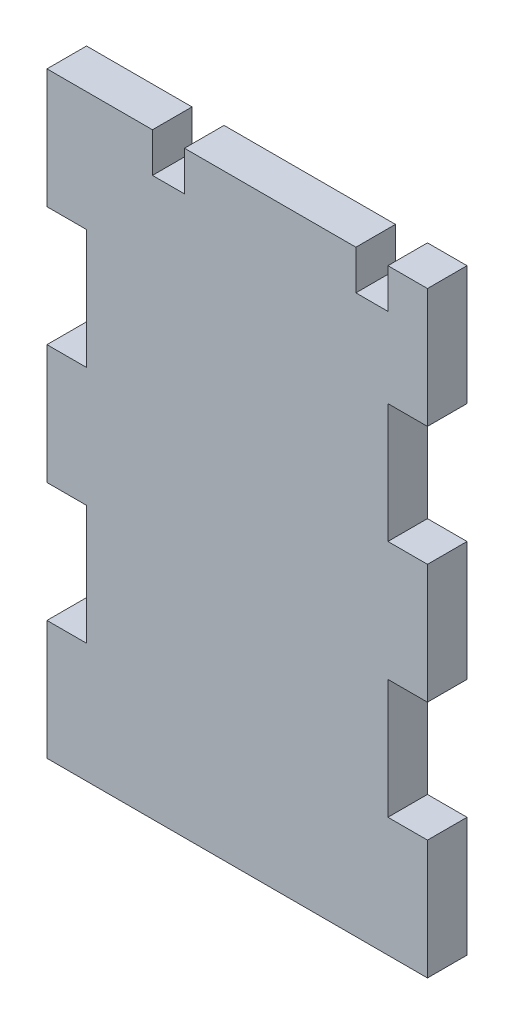
ISO-10303-21;
HEADER;
FILE_DESCRIPTION(('STEP AP214'),'2;1');
FILE_NAME('part.step','',(''),(''),'','','');
FILE_SCHEMA(('AUTOMOTIVE_DESIGN { 1 0 10303 214 1 1 1 1 }'));
ENDSEC;
DATA;
#1=APPLICATION_CONTEXT('core data for automotive mechanical design processes');
#2=APPLICATION_PROTOCOL_DEFINITION('international standard','automotive_design',2000,#1);
#3=PRODUCT_CONTEXT('',#1,'mechanical');
#4=PRODUCT('Part','Part','',(#3));
#5=PRODUCT_RELATED_PRODUCT_CATEGORY('part','',(#4));
#6=PRODUCT_DEFINITION_FORMATION('','',#4);
#7=PRODUCT_DEFINITION_CONTEXT('part definition',#1,'design');
#8=PRODUCT_DEFINITION('design','',#6,#7);
#9=PRODUCT_DEFINITION_SHAPE('','',#8);
#10=(LENGTH_UNIT() NAMED_UNIT(*) SI_UNIT(.MILLI.,.METRE.));
#11=(NAMED_UNIT(*) PLANE_ANGLE_UNIT() SI_UNIT($,.RADIAN.));
#12=(NAMED_UNIT(*) SI_UNIT($,.STERADIAN.) SOLID_ANGLE_UNIT());
#13=UNCERTAINTY_MEASURE_WITH_UNIT(LENGTH_MEASURE(1.E-05),#10,'distance_accuracy_value','');
#14=(GEOMETRIC_REPRESENTATION_CONTEXT(3) GLOBAL_UNCERTAINTY_ASSIGNED_CONTEXT((#13)) GLOBAL_UNIT_ASSIGNED_CONTEXT((#10,
#11,#12)) REPRESENTATION_CONTEXT('',''));
#15=CARTESIAN_POINT('',(0.,0.,0.));
#16=DIRECTION('',(0.,0.,1.));
#17=DIRECTION('',(1.,0.,0.));
#18=AXIS2_PLACEMENT_3D('',#15,#16,#17);
#19=CARTESIAN_POINT('',(-38.9472787322979,40.8312132811787,5.334));
#20=DIRECTION('',(0.,-1.,0.));
#21=DIRECTION('',(0.,0.,-1.));
#22=AXIS2_PLACEMENT_3D('',#19,#20,#21);
#23=PLANE('',#22);
#24=DIRECTION('',(-1.,0.,0.));
#25=VECTOR('',#24,1.);
#26=CARTESIAN_POINT('',(-38.9472787322979,40.8312132811787,0.));
#27=LINE('',#26,#25);
#28=CARTESIAN_POINT('',(2.70872126770206,40.8312132811787,0.));
#29=VERTEX_POINT('',#28);
#30=CARTESIAN_POINT('',(-20.4052787322979,40.8312132811785,0.));
#31=VERTEX_POINT('',#30);
#32=EDGE_CURVE('E236',#29,#31,#27,.T.);
#33=ORIENTED_EDGE('',*,*,#32,.T.);
#34=DIRECTION('',(0.,0.,1.));
#35=VECTOR('',#34,1.);
#36=CARTESIAN_POINT('',(-20.4052787322979,40.8312132811785,0.));
#37=LINE('',#36,#35);
#38=CARTESIAN_POINT('',(-20.4052787322979,40.8312132811785,5.334));
#39=VERTEX_POINT('',#38);
#40=EDGE_CURVE('E220',#31,#39,#37,.T.);
#41=ORIENTED_EDGE('',*,*,#40,.T.);
#42=DIRECTION('',(-1.,0.,0.));
#43=VECTOR('',#42,1.);
#44=CARTESIAN_POINT('',(-38.9472787322979,40.8312132811787,5.334));
#45=LINE('',#44,#43);
#46=CARTESIAN_POINT('',(2.70872126770206,40.8312132811787,5.334));
#47=VERTEX_POINT('',#46);
#48=EDGE_CURVE('E292',#47,#39,#45,.T.);
#49=ORIENTED_EDGE('',*,*,#48,.F.);
#50=DIRECTION('',(0.,0.,1.));
#51=VECTOR('',#50,1.);
#52=CARTESIAN_POINT('',(2.70872126770206,40.8312132811787,0.));
#53=LINE('',#52,#51);
#54=EDGE_CURVE('E242',#29,#47,#53,.T.);
#55=ORIENTED_EDGE('',*,*,#54,.F.);
#56=EDGE_LOOP('',(#33,#41,#49,#55));
#57=FACE_BOUND('',#56,.T.);
#58=ADVANCED_FACE('F35',(#57),#23,.F.);
#59=CARTESIAN_POINT('',(12.3607212677021,40.8312132811787,0.));
#60=VERTEX_POINT('',#59);
#61=CARTESIAN_POINT('',(7.02672126770205,40.8312132811787,0.));
#62=VERTEX_POINT('',#61);
#63=EDGE_CURVE('E243',#60,#62,#27,.T.);
#64=ORIENTED_EDGE('',*,*,#63,.T.);
#65=DIRECTION('',(0.,0.,1.));
#66=VECTOR('',#65,1.);
#67=CARTESIAN_POINT('',(7.02672126770205,40.8312132811787,0.));
#68=LINE('',#67,#66);
#69=CARTESIAN_POINT('',(7.02672126770205,40.8312132811787,5.334));
#70=VERTEX_POINT('',#69);
#71=EDGE_CURVE('E396',#62,#70,#68,.T.);
#72=ORIENTED_EDGE('',*,*,#71,.T.);
#73=CARTESIAN_POINT('',(12.3607212677021,40.8312132811787,5.334));
#74=VERTEX_POINT('',#73);
#75=EDGE_CURVE('E256',#74,#70,#45,.T.);
#76=ORIENTED_EDGE('',*,*,#75,.F.);
#77=DIRECTION('',(0.,0.,-1.));
#78=VECTOR('',#77,1.);
#79=CARTESIAN_POINT('',(12.3607212677021,40.8312132811787,5.334));
#80=LINE('',#79,#78);
#81=EDGE_CURVE('E255',#74,#60,#80,.T.);
#82=ORIENTED_EDGE('',*,*,#81,.T.);
#83=EDGE_LOOP('',(#64,#72,#76,#82));
#84=FACE_BOUND('',#83,.T.);
#85=ADVANCED_FACE('F460',(#84),#23,.F.);
#86=CARTESIAN_POINT('',(12.3607212677021,40.8312132811787,5.334));
#87=DIRECTION('',(-1.,0.,0.));
#88=DIRECTION('',(0.,-1.,0.));
#89=AXIS2_PLACEMENT_3D('',#86,#87,#88);
#90=PLANE('',#89);
#91=DIRECTION('',(0.,1.,0.));
#92=VECTOR('',#91,1.);
#93=CARTESIAN_POINT('',(12.3607212677021,40.8312132811787,0.));
#94=LINE('',#93,#92);
#95=CARTESIAN_POINT('',(12.3607212677021,-7.47958671882125,0.));
#96=VERTEX_POINT('',#95);
#97=CARTESIAN_POINT('',(12.360721267702,8.62401328117875,0.));
#98=VERTEX_POINT('',#97);
#99=EDGE_CURVE('E277',#96,#98,#94,.T.);
#100=ORIENTED_EDGE('',*,*,#99,.T.);
#101=DIRECTION('',(0.,0.,1.));
#102=VECTOR('',#101,1.);
#103=CARTESIAN_POINT('',(12.360721267702,8.62401328117875,0.));
#104=LINE('',#103,#102);
#105=CARTESIAN_POINT('',(12.360721267702,8.62401328117875,5.334));
#106=VERTEX_POINT('',#105);
#107=EDGE_CURVE('E378',#98,#106,#104,.T.);
#108=ORIENTED_EDGE('',*,*,#107,.T.);
#109=DIRECTION('',(0.,1.,0.));
#110=VECTOR('',#109,1.);
#111=CARTESIAN_POINT('',(12.3607212677021,40.8312132811787,5.334));
#112=LINE('',#111,#110);
#113=CARTESIAN_POINT('',(12.3607212677021,-7.47958671882125,5.334));
#114=VERTEX_POINT('',#113);
#115=EDGE_CURVE('E295',#114,#106,#112,.T.);
#116=ORIENTED_EDGE('',*,*,#115,.F.);
#117=DIRECTION('',(0.,0.,1.));
#118=VECTOR('',#117,1.);
#119=CARTESIAN_POINT('',(12.3607212677021,-7.47958671882125,0.));
#120=LINE('',#119,#118);
#121=EDGE_CURVE('E358',#96,#114,#120,.T.);
#122=ORIENTED_EDGE('',*,*,#121,.F.);
#123=EDGE_LOOP('',(#100,#108,#116,#122));
#124=FACE_BOUND('',#123,.T.);
#125=ADVANCED_FACE('F473',(#124),#90,.F.);
#126=CARTESIAN_POINT('',(12.3607212677021,-39.6867867188213,0.));
#127=VERTEX_POINT('',#126);
#128=CARTESIAN_POINT('',(12.3607212677021,-23.5831867188212,0.));
#129=VERTEX_POINT('',#128);
#130=EDGE_CURVE('E248',#127,#129,#94,.T.);
#131=ORIENTED_EDGE('',*,*,#130,.T.);
#132=DIRECTION('',(0.,0.,1.));
#133=VECTOR('',#132,1.);
#134=CARTESIAN_POINT('',(12.3607212677021,-23.5831867188212,0.));
#135=LINE('',#134,#133);
#136=CARTESIAN_POINT('',(12.3607212677021,-23.5831867188212,5.334));
#137=VERTEX_POINT('',#136);
#138=EDGE_CURVE('E356',#129,#137,#135,.T.);
#139=ORIENTED_EDGE('',*,*,#138,.T.);
#140=CARTESIAN_POINT('',(12.3607212677021,-39.6867867188213,5.334));
#141=VERTEX_POINT('',#140);
#142=EDGE_CURVE('E267',#141,#137,#112,.T.);
#143=ORIENTED_EDGE('',*,*,#142,.F.);
#144=DIRECTION('',(0.,0.,-1.));
#145=VECTOR('',#144,1.);
#146=CARTESIAN_POINT('',(12.3607212677021,-39.6867867188213,5.334));
#147=LINE('',#146,#145);
#148=EDGE_CURVE('E43',#141,#127,#147,.T.);
#149=ORIENTED_EDGE('',*,*,#148,.T.);
#150=EDGE_LOOP('',(#131,#139,#143,#149));
#151=FACE_BOUND('',#150,.T.);
#152=ADVANCED_FACE('F264',(#151),#90,.F.);
#153=CARTESIAN_POINT('',(-38.9472787322979,40.8312132811787,5.334));
#154=DIRECTION('',(1.,0.,0.));
#155=DIRECTION('',(0.,0.,-1.));
#156=AXIS2_PLACEMENT_3D('',#153,#154,#155);
#157=PLANE('',#156);
#158=DIRECTION('',(0.,-1.,0.));
#159=VECTOR('',#158,1.);
#160=CARTESIAN_POINT('',(-38.9472787322979,40.8312132811787,0.));
#161=LINE('',#160,#159);
#162=CARTESIAN_POINT('',(-38.9472787322979,8.62401328117875,0.));
#163=VERTEX_POINT('',#162);
#164=CARTESIAN_POINT('',(-38.9472787322979,-7.47958671882126,0.));
#165=VERTEX_POINT('',#164);
#166=EDGE_CURVE('E286',#163,#165,#161,.T.);
#167=ORIENTED_EDGE('',*,*,#166,.T.);
#168=DIRECTION('',(0.,0.,1.));
#169=VECTOR('',#168,1.);
#170=CARTESIAN_POINT('',(-38.9472787322979,-7.47958671882126,0.));
#171=LINE('',#170,#169);
#172=CARTESIAN_POINT('',(-38.9472787322979,-7.47958671882126,5.334));
#173=VERTEX_POINT('',#172);
#174=EDGE_CURVE('E322',#165,#173,#171,.T.);
#175=ORIENTED_EDGE('',*,*,#174,.T.);
#176=DIRECTION('',(0.,-1.,0.));
#177=VECTOR('',#176,1.);
#178=CARTESIAN_POINT('',(-38.9472787322979,40.8312132811787,5.334));
#179=LINE('',#178,#177);
#180=CARTESIAN_POINT('',(-38.9472787322979,8.62401328117875,5.334));
#181=VERTEX_POINT('',#180);
#182=EDGE_CURVE('E302',#181,#173,#179,.T.);
#183=ORIENTED_EDGE('',*,*,#182,.F.);
#184=DIRECTION('',(0.,0.,1.));
#185=VECTOR('',#184,1.);
#186=CARTESIAN_POINT('',(-38.9472787322979,8.62401328117875,0.));
#187=LINE('',#186,#185);
#188=EDGE_CURVE('E303',#163,#181,#187,.T.);
#189=ORIENTED_EDGE('',*,*,#188,.F.);
#190=EDGE_LOOP('',(#167,#175,#183,#189));
#191=FACE_BOUND('',#190,.T.);
#192=ADVANCED_FACE('F513',(#191),#157,.F.);
#193=CARTESIAN_POINT('',(-38.9472787322979,40.8312132811787,0.));
#194=VERTEX_POINT('',#193);
#195=CARTESIAN_POINT('',(-38.9472787322979,24.7276132811787,0.));
#196=VERTEX_POINT('',#195);
#197=EDGE_CURVE('E284',#194,#196,#161,.T.);
#198=ORIENTED_EDGE('',*,*,#197,.T.);
#199=DIRECTION('',(0.,0.,1.));
#200=VECTOR('',#199,1.);
#201=CARTESIAN_POINT('',(-38.9472787322979,24.7276132811787,0.));
#202=LINE('',#201,#200);
#203=CARTESIAN_POINT('',(-38.9472787322979,24.7276132811787,5.334));
#204=VERTEX_POINT('',#203);
#205=EDGE_CURVE('E310',#196,#204,#202,.T.);
#206=ORIENTED_EDGE('',*,*,#205,.T.);
#207=CARTESIAN_POINT('',(-38.9472787322979,40.8312132811787,5.334));
#208=VERTEX_POINT('',#207);
#209=EDGE_CURVE('E299',#208,#204,#179,.T.);
#210=ORIENTED_EDGE('',*,*,#209,.F.);
#211=DIRECTION('',(0.,0.,-1.));
#212=VECTOR('',#211,1.);
#213=CARTESIAN_POINT('',(-38.9472787322979,40.8312132811787,5.334));
#214=LINE('',#213,#212);
#215=EDGE_CURVE('E252',#208,#194,#214,.T.);
#216=ORIENTED_EDGE('',*,*,#215,.T.);
#217=EDGE_LOOP('',(#198,#206,#210,#216));
#218=FACE_BOUND('',#217,.T.);
#219=ADVANCED_FACE('F517',(#218),#157,.F.);
#220=CARTESIAN_POINT('',(-38.9472787322979,-23.5831867188213,5.334));
#221=VERTEX_POINT('',#220);
#222=CARTESIAN_POINT('',(-38.9472787322979,-39.6867867188213,5.334));
#223=VERTEX_POINT('',#222);
#224=EDGE_CURVE('E247',#221,#223,#179,.T.);
#225=ORIENTED_EDGE('',*,*,#224,.F.);
#226=DIRECTION('',(0.,0.,1.));
#227=VECTOR('',#226,1.);
#228=CARTESIAN_POINT('',(-38.9472787322979,-23.5831867188213,0.));
#229=LINE('',#228,#227);
#230=CARTESIAN_POINT('',(-38.9472787322979,-23.5831867188213,0.));
#231=VERTEX_POINT('',#230);
#232=EDGE_CURVE('E330',#231,#221,#229,.T.);
#233=ORIENTED_EDGE('',*,*,#232,.F.);
#234=CARTESIAN_POINT('',(-38.9472787322979,-39.6867867188213,0.));
#235=VERTEX_POINT('',#234);
#236=EDGE_CURVE('E288',#231,#235,#161,.T.);
#237=ORIENTED_EDGE('',*,*,#236,.T.);
#238=DIRECTION('',(0.,0.,-1.));
#239=VECTOR('',#238,1.);
#240=CARTESIAN_POINT('',(-38.9472787322979,-39.6867867188213,5.334));
#241=LINE('',#240,#239);
#242=EDGE_CURVE('E11',#223,#235,#241,.T.);
#243=ORIENTED_EDGE('',*,*,#242,.F.);
#244=EDGE_LOOP('',(#225,#233,#237,#243));
#245=FACE_BOUND('',#244,.T.);
#246=ADVANCED_FACE('F37',(#245),#157,.F.);
#247=CARTESIAN_POINT('',(-38.9472787322979,-39.6867867188213,5.334));
#248=DIRECTION('',(0.,1.,0.));
#249=DIRECTION('',(0.,0.,1.));
#250=AXIS2_PLACEMENT_3D('',#247,#248,#249);
#251=PLANE('',#250);
#252=DIRECTION('',(1.,0.,0.));
#253=VECTOR('',#252,1.);
#254=CARTESIAN_POINT('',(-38.9472787322979,-39.6867867188213,0.));
#255=LINE('',#254,#253);
#256=EDGE_CURVE('E273',#235,#127,#255,.T.);
#257=ORIENTED_EDGE('',*,*,#256,.T.);
#258=ORIENTED_EDGE('',*,*,#148,.F.);
#259=DIRECTION('',(1.,0.,0.));
#260=VECTOR('',#259,1.);
#261=CARTESIAN_POINT('',(-38.9472787322979,-39.6867867188213,5.334));
#262=LINE('',#261,#260);
#263=EDGE_CURVE('E297',#223,#141,#262,.T.);
#264=ORIENTED_EDGE('',*,*,#263,.F.);
#265=ORIENTED_EDGE('',*,*,#242,.T.);
#266=EDGE_LOOP('',(#257,#258,#264,#265));
#267=FACE_BOUND('',#266,.T.);
#268=ADVANCED_FACE('F507',(#267),#251,.F.);
#269=CARTESIAN_POINT('',(12.3607212677021,24.7276132811787,5.334));
#270=VERTEX_POINT('',#269);
#271=EDGE_CURVE('E296',#270,#74,#112,.T.);
#272=ORIENTED_EDGE('',*,*,#271,.F.);
#273=DIRECTION('',(0.,0.,1.));
#274=VECTOR('',#273,1.);
#275=CARTESIAN_POINT('',(12.3607212677021,24.7276132811787,0.));
#276=LINE('',#275,#274);
#277=CARTESIAN_POINT('',(12.3607212677021,24.7276132811787,0.));
#278=VERTEX_POINT('',#277);
#279=EDGE_CURVE('E381',#278,#270,#276,.T.);
#280=ORIENTED_EDGE('',*,*,#279,.F.);
#281=EDGE_CURVE('E278',#278,#60,#94,.T.);
#282=ORIENTED_EDGE('',*,*,#281,.T.);
#283=ORIENTED_EDGE('',*,*,#81,.F.);
#284=EDGE_LOOP('',(#272,#280,#282,#283));
#285=FACE_BOUND('',#284,.T.);
#286=ADVANCED_FACE('F463',(#285),#90,.F.);
#287=CARTESIAN_POINT('',(-24.7232787322979,40.8312132811785,5.334));
#288=VERTEX_POINT('',#287);
#289=EDGE_CURVE('E293',#288,#208,#45,.T.);
#290=ORIENTED_EDGE('',*,*,#289,.F.);
#291=DIRECTION('',(0.,0.,1.));
#292=VECTOR('',#291,1.);
#293=CARTESIAN_POINT('',(-24.7232787322979,40.8312132811785,0.));
#294=LINE('',#293,#292);
#295=CARTESIAN_POINT('',(-24.7232787322979,40.8312132811785,0.));
#296=VERTEX_POINT('',#295);
#297=EDGE_CURVE('E230',#296,#288,#294,.T.);
#298=ORIENTED_EDGE('',*,*,#297,.F.);
#299=EDGE_CURVE('E244',#296,#194,#27,.T.);
#300=ORIENTED_EDGE('',*,*,#299,.T.);
#301=ORIENTED_EDGE('',*,*,#215,.F.);
#302=EDGE_LOOP('',(#290,#298,#300,#301));
#303=FACE_BOUND('',#302,.T.);
#304=ADVANCED_FACE('F445',(#303),#23,.F.);
#305=CARTESIAN_POINT('',(0.,0.,5.334));
#306=DIRECTION('',(0.,0.,1.));
#307=DIRECTION('',(1.,0.,0.));
#308=AXIS2_PLACEMENT_3D('',#305,#306,#307);
#309=PLANE('',#308);
#310=DIRECTION('',(0.,1.,0.));
#311=VECTOR('',#310,1.);
#312=CARTESIAN_POINT('',(-20.4052787322979,35.4972132811785,5.334));
#313=LINE('',#312,#311);
#314=CARTESIAN_POINT('',(-20.4052787322979,35.4972132811785,5.334));
#315=VERTEX_POINT('',#314);
#316=EDGE_CURVE('E225',#315,#39,#313,.T.);
#317=ORIENTED_EDGE('',*,*,#316,.F.);
#318=DIRECTION('',(1.,0.,0.));
#319=VECTOR('',#318,1.);
#320=CARTESIAN_POINT('',(-20.4052787322979,35.4972132811785,5.334));
#321=LINE('',#320,#319);
#322=CARTESIAN_POINT('',(-24.7232787322979,35.4972132811785,5.334));
#323=VERTEX_POINT('',#322);
#324=EDGE_CURVE('E239',#323,#315,#321,.T.);
#325=ORIENTED_EDGE('',*,*,#324,.F.);
#326=DIRECTION('',(0.,-1.,0.));
#327=VECTOR('',#326,1.);
#328=CARTESIAN_POINT('',(-24.7232787322979,35.4972132811785,5.334));
#329=LINE('',#328,#327);
#330=EDGE_CURVE('E432',#288,#323,#329,.T.);
#331=ORIENTED_EDGE('',*,*,#330,.F.);
#332=ORIENTED_EDGE('',*,*,#289,.T.);
#333=ORIENTED_EDGE('',*,*,#209,.T.);
#334=DIRECTION('',(-1.,0.,0.));
#335=VECTOR('',#334,1.);
#336=CARTESIAN_POINT('',(-38.9472787322979,24.7276132811787,5.334));
#337=LINE('',#336,#335);
#338=CARTESIAN_POINT('',(-33.6132787322979,24.7276132811787,5.334));
#339=VERTEX_POINT('',#338);
#340=EDGE_CURVE('E313',#339,#204,#337,.T.);
#341=ORIENTED_EDGE('',*,*,#340,.F.);
#342=DIRECTION('',(0.,1.,0.));
#343=VECTOR('',#342,1.);
#344=CARTESIAN_POINT('',(-33.6132787322979,24.7276132811787,5.334));
#345=LINE('',#344,#343);
#346=CARTESIAN_POINT('',(-33.6132787322979,8.62401328117875,5.334));
#347=VERTEX_POINT('',#346);
#348=EDGE_CURVE('E316',#347,#339,#345,.T.);
#349=ORIENTED_EDGE('',*,*,#348,.F.);
#350=DIRECTION('',(1.,0.,0.));
#351=VECTOR('',#350,1.);
#352=CARTESIAN_POINT('',(-38.9472787322979,8.62401328117875,5.334));
#353=LINE('',#352,#351);
#354=EDGE_CURVE('E319',#181,#347,#353,.T.);
#355=ORIENTED_EDGE('',*,*,#354,.F.);
#356=ORIENTED_EDGE('',*,*,#182,.T.);
#357=DIRECTION('',(-1.,0.,0.));
#358=VECTOR('',#357,1.);
#359=CARTESIAN_POINT('',(-38.9472787322979,-7.47958671882126,5.334));
#360=LINE('',#359,#358);
#361=CARTESIAN_POINT('',(-33.6132787322979,-7.47958671882126,5.334));
#362=VERTEX_POINT('',#361);
#363=EDGE_CURVE('E339',#362,#173,#360,.T.);
#364=ORIENTED_EDGE('',*,*,#363,.F.);
#365=DIRECTION('',(0.,1.,0.));
#366=VECTOR('',#365,1.);
#367=CARTESIAN_POINT('',(-33.6132787322979,-7.47958671882126,5.334));
#368=LINE('',#367,#366);
#369=CARTESIAN_POINT('',(-33.6132787322979,-23.5831867188213,5.334));
#370=VERTEX_POINT('',#369);
#371=EDGE_CURVE('E342',#370,#362,#368,.T.);
#372=ORIENTED_EDGE('',*,*,#371,.F.);
#373=DIRECTION('',(1.,0.,0.));
#374=VECTOR('',#373,1.);
#375=CARTESIAN_POINT('',(-38.9472787322979,-23.5831867188213,5.334));
#376=LINE('',#375,#374);
#377=EDGE_CURVE('E345',#221,#370,#376,.T.);
#378=ORIENTED_EDGE('',*,*,#377,.F.);
#379=ORIENTED_EDGE('',*,*,#224,.T.);
#380=ORIENTED_EDGE('',*,*,#263,.T.);
#381=ORIENTED_EDGE('',*,*,#142,.T.);
#382=DIRECTION('',(1.,0.,0.));
#383=VECTOR('',#382,1.);
#384=CARTESIAN_POINT('',(12.3607212677021,-23.5831867188212,5.334));
#385=LINE('',#384,#383);
#386=CARTESIAN_POINT('',(7.02672126770205,-23.5831867188213,5.334));
#387=VERTEX_POINT('',#386);
#388=EDGE_CURVE('E370',#387,#137,#385,.T.);
#389=ORIENTED_EDGE('',*,*,#388,.F.);
#390=DIRECTION('',(0.,-1.,0.));
#391=VECTOR('',#390,1.);
#392=CARTESIAN_POINT('',(7.02672126770206,-7.47958671882125,5.334));
#393=LINE('',#392,#391);
#394=CARTESIAN_POINT('',(7.02672126770206,-7.47958671882125,5.334));
#395=VERTEX_POINT('',#394);
#396=EDGE_CURVE('E364',#395,#387,#393,.T.);
#397=ORIENTED_EDGE('',*,*,#396,.F.);
#398=DIRECTION('',(-1.,0.,0.));
#399=VECTOR('',#398,1.);
#400=CARTESIAN_POINT('',(12.3607212677021,-7.47958671882125,5.334));
#401=LINE('',#400,#399);
#402=EDGE_CURVE('E367',#114,#395,#401,.T.);
#403=ORIENTED_EDGE('',*,*,#402,.F.);
#404=ORIENTED_EDGE('',*,*,#115,.T.);
#405=DIRECTION('',(1.,0.,0.));
#406=VECTOR('',#405,1.);
#407=CARTESIAN_POINT('',(12.360721267702,8.62401328117875,5.334));
#408=LINE('',#407,#406);
#409=CARTESIAN_POINT('',(7.02672126770205,8.62401328117875,5.334));
#410=VERTEX_POINT('',#409);
#411=EDGE_CURVE('E394',#410,#106,#408,.T.);
#412=ORIENTED_EDGE('',*,*,#411,.F.);
#413=DIRECTION('',(0.,-1.,0.));
#414=VECTOR('',#413,1.);
#415=CARTESIAN_POINT('',(7.02672126770205,24.7276132811787,5.334));
#416=LINE('',#415,#414);
#417=CARTESIAN_POINT('',(7.02672126770205,24.7276132811787,5.334));
#418=VERTEX_POINT('',#417);
#419=EDGE_CURVE('E387',#418,#410,#416,.T.);
#420=ORIENTED_EDGE('',*,*,#419,.F.);
#421=DIRECTION('',(-1.,0.,0.));
#422=VECTOR('',#421,1.);
#423=CARTESIAN_POINT('',(12.3607212677021,24.7276132811787,5.334));
#424=LINE('',#423,#422);
#425=EDGE_CURVE('E391',#270,#418,#424,.T.);
#426=ORIENTED_EDGE('',*,*,#425,.F.);
#427=ORIENTED_EDGE('',*,*,#271,.T.);
#428=ORIENTED_EDGE('',*,*,#75,.T.);
#429=DIRECTION('',(0.,1.,0.));
#430=VECTOR('',#429,1.);
#431=CARTESIAN_POINT('',(7.02672126770205,35.4972132811787,5.334));
#432=LINE('',#431,#430);
#433=CARTESIAN_POINT('',(7.02672126770205,35.4972132811787,5.334));
#434=VERTEX_POINT('',#433);
#435=EDGE_CURVE('E412',#434,#70,#432,.T.);
#436=ORIENTED_EDGE('',*,*,#435,.F.);
#437=DIRECTION('',(1.,0.,0.));
#438=VECTOR('',#437,1.);
#439=CARTESIAN_POINT('',(7.02672126770205,35.4972132811787,5.334));
#440=LINE('',#439,#438);
#441=CARTESIAN_POINT('',(2.70872126770206,35.4972132811787,5.334));
#442=VERTEX_POINT('',#441);
#443=EDGE_CURVE('E415',#442,#434,#440,.T.);
#444=ORIENTED_EDGE('',*,*,#443,.F.);
#445=DIRECTION('',(0.,-1.,0.));
#446=VECTOR('',#445,1.);
#447=CARTESIAN_POINT('',(2.70872126770206,35.4972132811787,5.334));
#448=LINE('',#447,#446);
#449=EDGE_CURVE('E418',#47,#442,#448,.T.);
#450=ORIENTED_EDGE('',*,*,#449,.F.);
#451=ORIENTED_EDGE('',*,*,#48,.T.);
#452=EDGE_LOOP('',(#317,#325,#331,#332,#333,#341,#349,#355,#356,#364,#372,#378,#379,#380,#381,
#389,#397,#403,#404,#412,#420,#426,#427,#428,#436,#444,#450,#451));
#453=FACE_BOUND('',#452,.T.);
#454=ADVANCED_FACE('F450',(#453),#309,.T.);
#455=CARTESIAN_POINT('',(0.,0.,0.));
#456=DIRECTION('',(0.,0.,1.));
#457=DIRECTION('',(1.,0.,0.));
#458=AXIS2_PLACEMENT_3D('',#455,#456,#457);
#459=PLANE('',#458);
#460=DIRECTION('',(1.,0.,0.));
#461=VECTOR('',#460,1.);
#462=CARTESIAN_POINT('',(-20.4052787322979,35.4972132811785,0.));
#463=LINE('',#462,#461);
#464=CARTESIAN_POINT('',(-24.7232787322979,35.4972132811785,0.));
#465=VERTEX_POINT('',#464);
#466=CARTESIAN_POINT('',(-20.4052787322979,35.4972132811785,0.));
#467=VERTEX_POINT('',#466);
#468=EDGE_CURVE('E50',#465,#467,#463,.T.);
#469=ORIENTED_EDGE('',*,*,#468,.T.);
#470=DIRECTION('',(0.,1.,0.));
#471=VECTOR('',#470,1.);
#472=CARTESIAN_POINT('',(-20.4052787322979,35.4972132811785,0.));
#473=LINE('',#472,#471);
#474=EDGE_CURVE('E223',#467,#31,#473,.T.);
#475=ORIENTED_EDGE('',*,*,#474,.T.);
#476=ORIENTED_EDGE('',*,*,#32,.F.);
#477=DIRECTION('',(0.,-1.,0.));
#478=VECTOR('',#477,1.);
#479=CARTESIAN_POINT('',(2.70872126770206,35.4972132811787,0.));
#480=LINE('',#479,#478);
#481=CARTESIAN_POINT('',(2.70872126770206,35.4972132811787,0.));
#482=VERTEX_POINT('',#481);
#483=EDGE_CURVE('E414',#29,#482,#480,.T.);
#484=ORIENTED_EDGE('',*,*,#483,.T.);
#485=DIRECTION('',(1.,0.,0.));
#486=VECTOR('',#485,1.);
#487=CARTESIAN_POINT('',(7.02672126770205,35.4972132811787,0.));
#488=LINE('',#487,#486);
#489=CARTESIAN_POINT('',(7.02672126770205,35.4972132811787,0.));
#490=VERTEX_POINT('',#489);
#491=EDGE_CURVE('E58',#482,#490,#488,.T.);
#492=ORIENTED_EDGE('',*,*,#491,.T.);
#493=DIRECTION('',(0.,1.,0.));
#494=VECTOR('',#493,1.);
#495=CARTESIAN_POINT('',(7.02672126770205,35.4972132811787,0.));
#496=LINE('',#495,#494);
#497=EDGE_CURVE('E406',#490,#62,#496,.T.);
#498=ORIENTED_EDGE('',*,*,#497,.T.);
#499=ORIENTED_EDGE('',*,*,#63,.F.);
#500=ORIENTED_EDGE('',*,*,#281,.F.);
#501=DIRECTION('',(-1.,0.,0.));
#502=VECTOR('',#501,1.);
#503=CARTESIAN_POINT('',(12.3607212677021,24.7276132811787,0.));
#504=LINE('',#503,#502);
#505=CARTESIAN_POINT('',(7.02672126770205,24.7276132811787,0.));
#506=VERTEX_POINT('',#505);
#507=EDGE_CURVE('E399',#278,#506,#504,.T.);
#508=ORIENTED_EDGE('',*,*,#507,.T.);
#509=DIRECTION('',(0.,-1.,0.));
#510=VECTOR('',#509,1.);
#511=CARTESIAN_POINT('',(7.02672126770205,24.7276132811787,0.));
#512=LINE('',#511,#510);
#513=CARTESIAN_POINT('',(7.02672126770205,8.62401328117875,0.));
#514=VERTEX_POINT('',#513);
#515=EDGE_CURVE('E382',#506,#514,#512,.T.);
#516=ORIENTED_EDGE('',*,*,#515,.T.);
#517=DIRECTION('',(1.,0.,0.));
#518=VECTOR('',#517,1.);
#519=CARTESIAN_POINT('',(12.360721267702,8.62401328117875,0.));
#520=LINE('',#519,#518);
#521=EDGE_CURVE('E390',#514,#98,#520,.T.);
#522=ORIENTED_EDGE('',*,*,#521,.T.);
#523=ORIENTED_EDGE('',*,*,#99,.F.);
#524=DIRECTION('',(-1.,0.,0.));
#525=VECTOR('',#524,1.);
#526=CARTESIAN_POINT('',(12.3607212677021,-7.47958671882125,0.));
#527=LINE('',#526,#525);
#528=CARTESIAN_POINT('',(7.02672126770206,-7.47958671882125,0.));
#529=VERTEX_POINT('',#528);
#530=EDGE_CURVE('E374',#96,#529,#527,.T.);
#531=ORIENTED_EDGE('',*,*,#530,.T.);
#532=DIRECTION('',(0.,-1.,0.));
#533=VECTOR('',#532,1.);
#534=CARTESIAN_POINT('',(7.02672126770206,-7.47958671882125,0.));
#535=LINE('',#534,#533);
#536=CARTESIAN_POINT('',(7.02672126770205,-23.5831867188213,0.));
#537=VERTEX_POINT('',#536);
#538=EDGE_CURVE('E359',#529,#537,#535,.T.);
#539=ORIENTED_EDGE('',*,*,#538,.T.);
#540=DIRECTION('',(1.,0.,0.));
#541=VECTOR('',#540,1.);
#542=CARTESIAN_POINT('',(12.3607212677021,-23.5831867188212,0.));
#543=LINE('',#542,#541);
#544=EDGE_CURVE('E276',#537,#129,#543,.T.);
#545=ORIENTED_EDGE('',*,*,#544,.T.);
#546=ORIENTED_EDGE('',*,*,#130,.F.);
#547=ORIENTED_EDGE('',*,*,#256,.F.);
#548=ORIENTED_EDGE('',*,*,#236,.F.);
#549=DIRECTION('',(1.,0.,0.));
#550=VECTOR('',#549,1.);
#551=CARTESIAN_POINT('',(-38.9472787322979,-23.5831867188213,0.));
#552=LINE('',#551,#550);
#553=CARTESIAN_POINT('',(-33.6132787322979,-23.5831867188213,0.));
#554=VERTEX_POINT('',#553);
#555=EDGE_CURVE('E341',#231,#554,#552,.T.);
#556=ORIENTED_EDGE('',*,*,#555,.T.);
#557=DIRECTION('',(0.,1.,0.));
#558=VECTOR('',#557,1.);
#559=CARTESIAN_POINT('',(-33.6132787322979,-7.47958671882126,0.));
#560=LINE('',#559,#558);
#561=CARTESIAN_POINT('',(-33.6132787322979,-7.47958671882126,0.));
#562=VERTEX_POINT('',#561);
#563=EDGE_CURVE('E351',#554,#562,#560,.T.);
#564=ORIENTED_EDGE('',*,*,#563,.T.);
#565=DIRECTION('',(-1.,0.,0.));
#566=VECTOR('',#565,1.);
#567=CARTESIAN_POINT('',(-38.9472787322979,-7.47958671882126,0.));
#568=LINE('',#567,#566);
#569=EDGE_CURVE('E333',#562,#165,#568,.T.);
#570=ORIENTED_EDGE('',*,*,#569,.T.);
#571=ORIENTED_EDGE('',*,*,#166,.F.);
#572=DIRECTION('',(1.,0.,0.));
#573=VECTOR('',#572,1.);
#574=CARTESIAN_POINT('',(-38.9472787322979,8.62401328117875,0.));
#575=LINE('',#574,#573);
#576=CARTESIAN_POINT('',(-33.6132787322979,8.62401328117875,0.));
#577=VERTEX_POINT('',#576);
#578=EDGE_CURVE('E315',#163,#577,#575,.T.);
#579=ORIENTED_EDGE('',*,*,#578,.T.);
#580=DIRECTION('',(0.,1.,0.));
#581=VECTOR('',#580,1.);
#582=CARTESIAN_POINT('',(-33.6132787322979,24.7276132811787,0.));
#583=LINE('',#582,#581);
#584=CARTESIAN_POINT('',(-33.6132787322979,24.7276132811787,0.));
#585=VERTEX_POINT('',#584);
#586=EDGE_CURVE('E325',#577,#585,#583,.T.);
#587=ORIENTED_EDGE('',*,*,#586,.T.);
#588=DIRECTION('',(-1.,0.,0.));
#589=VECTOR('',#588,1.);
#590=CARTESIAN_POINT('',(-38.9472787322979,24.7276132811787,0.));
#591=LINE('',#590,#589);
#592=EDGE_CURVE('E306',#585,#196,#591,.T.);
#593=ORIENTED_EDGE('',*,*,#592,.T.);
#594=ORIENTED_EDGE('',*,*,#197,.F.);
#595=ORIENTED_EDGE('',*,*,#299,.F.);
#596=DIRECTION('',(0.,-1.,0.));
#597=VECTOR('',#596,1.);
#598=CARTESIAN_POINT('',(-24.7232787322979,35.4972132811785,0.));
#599=LINE('',#598,#597);
#600=EDGE_CURVE('E238',#296,#465,#599,.T.);
#601=ORIENTED_EDGE('',*,*,#600,.T.);
#602=EDGE_LOOP('',(#469,#475,#476,#484,#492,#498,#499,#500,#508,#516,#522,#523,#531,#539,#545,
#546,#547,#548,#556,#564,#570,#571,#579,#587,#593,#594,#595,#601));
#603=FACE_BOUND('',#602,.T.);
#604=ADVANCED_FACE('F234',(#603),#459,.F.);
#605=CARTESIAN_POINT('',(-38.9472787322979,24.7276132811787,0.));
#606=DIRECTION('',(0.,1.,0.));
#607=DIRECTION('',(0.,0.,1.));
#608=AXIS2_PLACEMENT_3D('',#605,#606,#607);
#609=PLANE('',#608);
#610=ORIENTED_EDGE('',*,*,#340,.T.);
#611=ORIENTED_EDGE('',*,*,#205,.F.);
#612=ORIENTED_EDGE('',*,*,#592,.F.);
#613=DIRECTION('',(0.,0.,1.));
#614=VECTOR('',#613,1.);
#615=CARTESIAN_POINT('',(-33.6132787322979,24.7276132811787,0.));
#616=LINE('',#615,#614);
#617=EDGE_CURVE('E308',#585,#339,#616,.T.);
#618=ORIENTED_EDGE('',*,*,#617,.T.);
#619=EDGE_LOOP('',(#610,#611,#612,#618));
#620=FACE_BOUND('',#619,.T.);
#621=ADVANCED_FACE('F561',(#620),#609,.F.);
#622=CARTESIAN_POINT('',(-33.6132787322979,24.7276132811787,0.));
#623=DIRECTION('',(1.,0.,0.));
#624=DIRECTION('',(0.,0.,-1.));
#625=AXIS2_PLACEMENT_3D('',#622,#623,#624);
#626=PLANE('',#625);
#627=ORIENTED_EDGE('',*,*,#348,.T.);
#628=ORIENTED_EDGE('',*,*,#617,.F.);
#629=ORIENTED_EDGE('',*,*,#586,.F.);
#630=DIRECTION('',(0.,0.,1.));
#631=VECTOR('',#630,1.);
#632=CARTESIAN_POINT('',(-33.6132787322979,8.62401328117875,0.));
#633=LINE('',#632,#631);
#634=EDGE_CURVE('E305',#577,#347,#633,.T.);
#635=ORIENTED_EDGE('',*,*,#634,.T.);
#636=EDGE_LOOP('',(#627,#628,#629,#635));
#637=FACE_BOUND('',#636,.T.);
#638=ADVANCED_FACE('F564',(#637),#626,.F.);
#639=CARTESIAN_POINT('',(-38.9472787322979,8.62401328117875,0.));
#640=DIRECTION('',(0.,-1.,0.));
#641=DIRECTION('',(0.,0.,-1.));
#642=AXIS2_PLACEMENT_3D('',#639,#640,#641);
#643=PLANE('',#642);
#644=ORIENTED_EDGE('',*,*,#354,.T.);
#645=ORIENTED_EDGE('',*,*,#634,.F.);
#646=ORIENTED_EDGE('',*,*,#578,.F.);
#647=ORIENTED_EDGE('',*,*,#188,.T.);
#648=EDGE_LOOP('',(#644,#645,#646,#647));
#649=FACE_BOUND('',#648,.T.);
#650=ADVANCED_FACE('F568',(#649),#643,.F.);
#651=CARTESIAN_POINT('',(-38.9472787322979,-7.47958671882126,0.));
#652=DIRECTION('',(0.,1.,0.));
#653=DIRECTION('',(0.,0.,1.));
#654=AXIS2_PLACEMENT_3D('',#651,#652,#653);
#655=PLANE('',#654);
#656=ORIENTED_EDGE('',*,*,#363,.T.);
#657=ORIENTED_EDGE('',*,*,#174,.F.);
#658=ORIENTED_EDGE('',*,*,#569,.F.);
#659=DIRECTION('',(0.,0.,1.));
#660=VECTOR('',#659,1.);
#661=CARTESIAN_POINT('',(-33.6132787322979,-7.47958671882126,0.));
#662=LINE('',#661,#660);
#663=EDGE_CURVE('E335',#562,#362,#662,.T.);
#664=ORIENTED_EDGE('',*,*,#663,.T.);
#665=EDGE_LOOP('',(#656,#657,#658,#664));
#666=FACE_BOUND('',#665,.T.);
#667=ADVANCED_FACE('F542',(#666),#655,.F.);
#668=CARTESIAN_POINT('',(-33.6132787322979,-7.47958671882126,0.));
#669=DIRECTION('',(1.,0.,0.));
#670=DIRECTION('',(0.,1.,0.));
#671=AXIS2_PLACEMENT_3D('',#668,#669,#670);
#672=PLANE('',#671);
#673=ORIENTED_EDGE('',*,*,#371,.T.);
#674=ORIENTED_EDGE('',*,*,#663,.F.);
#675=ORIENTED_EDGE('',*,*,#563,.F.);
#676=DIRECTION('',(0.,0.,1.));
#677=VECTOR('',#676,1.);
#678=CARTESIAN_POINT('',(-33.6132787322979,-23.5831867188213,0.));
#679=LINE('',#678,#677);
#680=EDGE_CURVE('E332',#554,#370,#679,.T.);
#681=ORIENTED_EDGE('',*,*,#680,.T.);
#682=EDGE_LOOP('',(#673,#674,#675,#681));
#683=FACE_BOUND('',#682,.T.);
#684=ADVANCED_FACE('F545',(#683),#672,.F.);
#685=CARTESIAN_POINT('',(-38.9472787322979,-23.5831867188213,0.));
#686=DIRECTION('',(0.,-1.,0.));
#687=DIRECTION('',(0.,0.,-1.));
#688=AXIS2_PLACEMENT_3D('',#685,#686,#687);
#689=PLANE('',#688);
#690=ORIENTED_EDGE('',*,*,#377,.T.);
#691=ORIENTED_EDGE('',*,*,#680,.F.);
#692=ORIENTED_EDGE('',*,*,#555,.F.);
#693=ORIENTED_EDGE('',*,*,#232,.T.);
#694=EDGE_LOOP('',(#690,#691,#692,#693));
#695=FACE_BOUND('',#694,.T.);
#696=ADVANCED_FACE('F547',(#695),#689,.F.);
#697=CARTESIAN_POINT('',(12.3607212677021,-23.5831867188212,0.));
#698=DIRECTION('',(0.,-1.,0.));
#699=DIRECTION('',(1.,0.,0.));
#700=AXIS2_PLACEMENT_3D('',#697,#698,#699);
#701=PLANE('',#700);
#702=ORIENTED_EDGE('',*,*,#388,.T.);
#703=ORIENTED_EDGE('',*,*,#138,.F.);
#704=ORIENTED_EDGE('',*,*,#544,.F.);
#705=DIRECTION('',(0.,0.,1.));
#706=VECTOR('',#705,1.);
#707=CARTESIAN_POINT('',(7.02672126770205,-23.5831867188213,0.));
#708=LINE('',#707,#706);
#709=EDGE_CURVE('E348',#537,#387,#708,.T.);
#710=ORIENTED_EDGE('',*,*,#709,.T.);
#711=EDGE_LOOP('',(#702,#703,#704,#710));
#712=FACE_BOUND('',#711,.T.);
#713=ADVANCED_FACE('F549',(#712),#701,.F.);
#714=CARTESIAN_POINT('',(7.02672126770206,-7.47958671882125,0.));
#715=DIRECTION('',(-1.,0.,0.));
#716=DIRECTION('',(0.,-1.,0.));
#717=AXIS2_PLACEMENT_3D('',#714,#715,#716);
#718=PLANE('',#717);
#719=ORIENTED_EDGE('',*,*,#396,.T.);
#720=ORIENTED_EDGE('',*,*,#709,.F.);
#721=ORIENTED_EDGE('',*,*,#538,.F.);
#722=DIRECTION('',(0.,0.,1.));
#723=VECTOR('',#722,1.);
#724=CARTESIAN_POINT('',(7.02672126770206,-7.47958671882125,0.));
#725=LINE('',#724,#723);
#726=EDGE_CURVE('E361',#529,#395,#725,.T.);
#727=ORIENTED_EDGE('',*,*,#726,.T.);
#728=EDGE_LOOP('',(#719,#720,#721,#727));
#729=FACE_BOUND('',#728,.T.);
#730=ADVANCED_FACE('F555',(#729),#718,.F.);
#731=CARTESIAN_POINT('',(12.3607212677021,-7.47958671882125,0.));
#732=DIRECTION('',(0.,1.,0.));
#733=DIRECTION('',(-1.,0.,0.));
#734=AXIS2_PLACEMENT_3D('',#731,#732,#733);
#735=PLANE('',#734);
#736=ORIENTED_EDGE('',*,*,#402,.T.);
#737=ORIENTED_EDGE('',*,*,#726,.F.);
#738=ORIENTED_EDGE('',*,*,#530,.F.);
#739=ORIENTED_EDGE('',*,*,#121,.T.);
#740=EDGE_LOOP('',(#736,#737,#738,#739));
#741=FACE_BOUND('',#740,.T.);
#742=ADVANCED_FACE('F618',(#741),#735,.F.);
#743=CARTESIAN_POINT('',(12.360721267702,8.62401328117875,0.));
#744=DIRECTION('',(0.,-1.,0.));
#745=DIRECTION('',(1.,0.,0.));
#746=AXIS2_PLACEMENT_3D('',#743,#744,#745);
#747=PLANE('',#746);
#748=ORIENTED_EDGE('',*,*,#411,.T.);
#749=ORIENTED_EDGE('',*,*,#107,.F.);
#750=ORIENTED_EDGE('',*,*,#521,.F.);
#751=DIRECTION('',(0.,0.,1.));
#752=VECTOR('',#751,1.);
#753=CARTESIAN_POINT('',(7.02672126770205,8.62401328117875,0.));
#754=LINE('',#753,#752);
#755=EDGE_CURVE('E372',#514,#410,#754,.T.);
#756=ORIENTED_EDGE('',*,*,#755,.T.);
#757=EDGE_LOOP('',(#748,#749,#750,#756));
#758=FACE_BOUND('',#757,.T.);
#759=ADVANCED_FACE('F477',(#758),#747,.F.);
#760=CARTESIAN_POINT('',(7.02672126770205,24.7276132811787,0.));
#761=DIRECTION('',(-1.,0.,0.));
#762=DIRECTION('',(0.,0.,1.));
#763=AXIS2_PLACEMENT_3D('',#760,#761,#762);
#764=PLANE('',#763);
#765=ORIENTED_EDGE('',*,*,#419,.T.);
#766=ORIENTED_EDGE('',*,*,#755,.F.);
#767=ORIENTED_EDGE('',*,*,#515,.F.);
#768=DIRECTION('',(0.,0.,1.));
#769=VECTOR('',#768,1.);
#770=CARTESIAN_POINT('',(7.02672126770205,24.7276132811787,0.));
#771=LINE('',#770,#769);
#772=EDGE_CURVE('E384',#506,#418,#771,.T.);
#773=ORIENTED_EDGE('',*,*,#772,.T.);
#774=EDGE_LOOP('',(#765,#766,#767,#773));
#775=FACE_BOUND('',#774,.T.);
#776=ADVANCED_FACE('F480',(#775),#764,.F.);
#777=CARTESIAN_POINT('',(12.3607212677021,24.7276132811787,0.));
#778=DIRECTION('',(0.,1.,0.));
#779=DIRECTION('',(-1.,0.,0.));
#780=AXIS2_PLACEMENT_3D('',#777,#778,#779);
#781=PLANE('',#780);
#782=ORIENTED_EDGE('',*,*,#425,.T.);
#783=ORIENTED_EDGE('',*,*,#772,.F.);
#784=ORIENTED_EDGE('',*,*,#507,.F.);
#785=ORIENTED_EDGE('',*,*,#279,.T.);
#786=EDGE_LOOP('',(#782,#783,#784,#785));
#787=FACE_BOUND('',#786,.T.);
#788=ADVANCED_FACE('F482',(#787),#781,.F.);
#789=CARTESIAN_POINT('',(7.02672126770205,35.4972132811787,0.));
#790=DIRECTION('',(1.,0.,0.));
#791=DIRECTION('',(0.,0.,-1.));
#792=AXIS2_PLACEMENT_3D('',#789,#790,#791);
#793=PLANE('',#792);
#794=ORIENTED_EDGE('',*,*,#435,.T.);
#795=ORIENTED_EDGE('',*,*,#71,.F.);
#796=ORIENTED_EDGE('',*,*,#497,.F.);
#797=DIRECTION('',(0.,0.,1.));
#798=VECTOR('',#797,1.);
#799=CARTESIAN_POINT('',(7.02672126770205,35.4972132811787,0.));
#800=LINE('',#799,#798);
#801=EDGE_CURVE('E408',#490,#434,#800,.T.);
#802=ORIENTED_EDGE('',*,*,#801,.T.);
#803=EDGE_LOOP('',(#794,#795,#796,#802));
#804=FACE_BOUND('',#803,.T.);
#805=ADVANCED_FACE('F484',(#804),#793,.F.);
#806=CARTESIAN_POINT('',(7.02672126770205,35.4972132811787,0.));
#807=DIRECTION('',(0.,-1.,0.));
#808=DIRECTION('',(0.,0.,-1.));
#809=AXIS2_PLACEMENT_3D('',#806,#807,#808);
#810=PLANE('',#809);
#811=ORIENTED_EDGE('',*,*,#443,.T.);
#812=ORIENTED_EDGE('',*,*,#801,.F.);
#813=ORIENTED_EDGE('',*,*,#491,.F.);
#814=DIRECTION('',(0.,0.,1.));
#815=VECTOR('',#814,1.);
#816=CARTESIAN_POINT('',(2.70872126770206,35.4972132811787,0.));
#817=LINE('',#816,#815);
#818=EDGE_CURVE('E405',#482,#442,#817,.T.);
#819=ORIENTED_EDGE('',*,*,#818,.T.);
#820=EDGE_LOOP('',(#811,#812,#813,#819));
#821=FACE_BOUND('',#820,.T.);
#822=ADVANCED_FACE('F490',(#821),#810,.F.);
#823=CARTESIAN_POINT('',(2.70872126770206,35.4972132811787,0.));
#824=DIRECTION('',(-1.,0.,0.));
#825=DIRECTION('',(0.,0.,1.));
#826=AXIS2_PLACEMENT_3D('',#823,#824,#825);
#827=PLANE('',#826);
#828=ORIENTED_EDGE('',*,*,#449,.T.);
#829=ORIENTED_EDGE('',*,*,#818,.F.);
#830=ORIENTED_EDGE('',*,*,#483,.F.);
#831=ORIENTED_EDGE('',*,*,#54,.T.);
#832=EDGE_LOOP('',(#828,#829,#830,#831));
#833=FACE_BOUND('',#832,.T.);
#834=ADVANCED_FACE('F455',(#833),#827,.F.);
#835=CARTESIAN_POINT('',(-20.4052787322979,35.4972132811785,0.));
#836=DIRECTION('',(1.,0.,0.));
#837=DIRECTION('',(0.,0.,-1.));
#838=AXIS2_PLACEMENT_3D('',#835,#836,#837);
#839=PLANE('',#838);
#840=ORIENTED_EDGE('',*,*,#316,.T.);
#841=ORIENTED_EDGE('',*,*,#40,.F.);
#842=ORIENTED_EDGE('',*,*,#474,.F.);
#843=DIRECTION('',(0.,0.,1.));
#844=VECTOR('',#843,1.);
#845=CARTESIAN_POINT('',(-20.4052787322979,35.4972132811785,0.));
#846=LINE('',#845,#844);
#847=EDGE_CURVE('E421',#467,#315,#846,.T.);
#848=ORIENTED_EDGE('',*,*,#847,.T.);
#849=EDGE_LOOP('',(#840,#841,#842,#848));
#850=FACE_BOUND('',#849,.T.);
#851=ADVANCED_FACE('F222',(#850),#839,.F.);
#852=CARTESIAN_POINT('',(-20.4052787322979,35.4972132811785,0.));
#853=DIRECTION('',(0.,-1.,0.));
#854=DIRECTION('',(0.,0.,-1.));
#855=AXIS2_PLACEMENT_3D('',#852,#853,#854);
#856=PLANE('',#855);
#857=ORIENTED_EDGE('',*,*,#324,.T.);
#858=ORIENTED_EDGE('',*,*,#847,.F.);
#859=ORIENTED_EDGE('',*,*,#468,.F.);
#860=DIRECTION('',(0.,0.,1.));
#861=VECTOR('',#860,1.);
#862=CARTESIAN_POINT('',(-24.7232787322979,35.4972132811785,0.));
#863=LINE('',#862,#861);
#864=EDGE_CURVE('E427',#465,#323,#863,.T.);
#865=ORIENTED_EDGE('',*,*,#864,.T.);
#866=EDGE_LOOP('',(#857,#858,#859,#865));
#867=FACE_BOUND('',#866,.T.);
#868=ADVANCED_FACE('F735',(#867),#856,.F.);
#869=CARTESIAN_POINT('',(-24.7232787322979,35.4972132811785,0.));
#870=DIRECTION('',(-1.,0.,0.));
#871=DIRECTION('',(0.,0.,1.));
#872=AXIS2_PLACEMENT_3D('',#869,#870,#871);
#873=PLANE('',#872);
#874=ORIENTED_EDGE('',*,*,#330,.T.);
#875=ORIENTED_EDGE('',*,*,#864,.F.);
#876=ORIENTED_EDGE('',*,*,#600,.F.);
#877=ORIENTED_EDGE('',*,*,#297,.T.);
#878=EDGE_LOOP('',(#874,#875,#876,#877));
#879=FACE_BOUND('',#878,.T.);
#880=ADVANCED_FACE('F441',(#879),#873,.F.);
#881=CLOSED_SHELL('',(#58,#85,#125,#152,#192,#219,#246,#268,#286,#304,#454,#604,#621,#638,#650,
#667,#684,#696,#713,#730,#742,#759,#776,#788,#805,#822,#834,#851,#868,#880));
#882=MANIFOLD_SOLID_BREP('B2',#881);
#883=ADVANCED_BREP_SHAPE_REPRESENTATION('',(#18,#882),#14);
#884=SHAPE_DEFINITION_REPRESENTATION(#9,#883);
ENDSEC;
END-ISO-10303-21;
